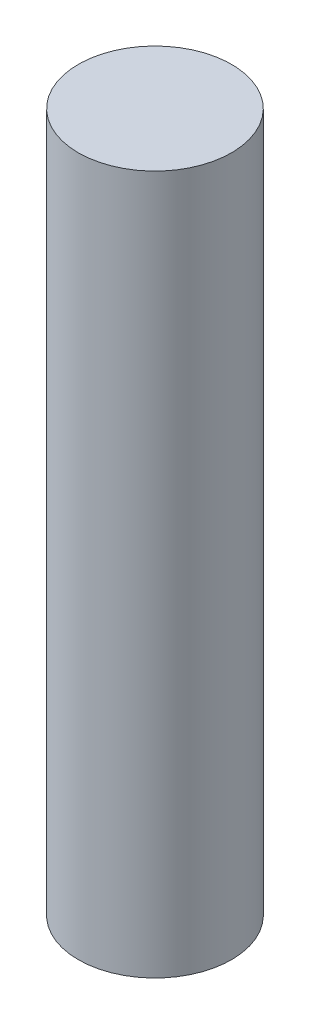
ISO-10303-21;
HEADER;
FILE_DESCRIPTION(('STEP AP214'),'2;1');
FILE_NAME('part.step','',(''),(''),'','','');
FILE_SCHEMA(('AUTOMOTIVE_DESIGN { 1 0 10303 214 1 1 1 1 }'));
ENDSEC;
DATA;
#1=APPLICATION_CONTEXT('core data for automotive mechanical design processes');
#2=APPLICATION_PROTOCOL_DEFINITION('international standard','automotive_design',2000,#1);
#3=PRODUCT_CONTEXT('',#1,'mechanical');
#4=PRODUCT('Part','Part','',(#3));
#5=PRODUCT_RELATED_PRODUCT_CATEGORY('part','',(#4));
#6=PRODUCT_DEFINITION_FORMATION('','',#4);
#7=PRODUCT_DEFINITION_CONTEXT('part definition',#1,'design');
#8=PRODUCT_DEFINITION('design','',#6,#7);
#9=PRODUCT_DEFINITION_SHAPE('','',#8);
#10=(LENGTH_UNIT() NAMED_UNIT(*) SI_UNIT(.MILLI.,.METRE.));
#11=(NAMED_UNIT(*) PLANE_ANGLE_UNIT() SI_UNIT($,.RADIAN.));
#12=(NAMED_UNIT(*) SI_UNIT($,.STERADIAN.) SOLID_ANGLE_UNIT());
#13=UNCERTAINTY_MEASURE_WITH_UNIT(LENGTH_MEASURE(1.E-05),#10,'distance_accuracy_value','');
#14=(GEOMETRIC_REPRESENTATION_CONTEXT(3) GLOBAL_UNCERTAINTY_ASSIGNED_CONTEXT((#13)) GLOBAL_UNIT_ASSIGNED_CONTEXT((#10,
#11,#12)) REPRESENTATION_CONTEXT('',''));
#15=CARTESIAN_POINT('',(0.,0.,0.));
#16=DIRECTION('',(0.,0.,1.));
#17=DIRECTION('',(1.,0.,0.));
#18=AXIS2_PLACEMENT_3D('',#15,#16,#17);
#19=CARTESIAN_POINT('',(0.,463.296,0.));
#20=DIRECTION('',(0.,-1.,0.));
#21=DIRECTION('',(0.,0.,-1.));
#22=AXIS2_PLACEMENT_3D('',#19,#20,#21);
#23=CYLINDRICAL_SURFACE('',#22,50.8);
#24=CARTESIAN_POINT('',(0.,463.296,0.));
#25=DIRECTION('',(0.,1.,0.));
#26=DIRECTION('',(0.,0.,1.));
#27=AXIS2_PLACEMENT_3D('',#24,#25,#26);
#28=CIRCLE('',#27,50.8);
#29=CARTESIAN_POINT('',(0.,463.296,50.8));
#30=VERTEX_POINT('',#29);
#31=EDGE_CURVE('E10',#30,#30,#28,.T.);
#32=ORIENTED_EDGE('',*,*,#31,.F.);
#33=EDGE_LOOP('',(#32));
#34=FACE_BOUND('',#33,.T.);
#35=CARTESIAN_POINT('',(0.,0.,0.));
#36=DIRECTION('',(0.,1.,0.));
#37=DIRECTION('',(0.,0.,1.));
#38=AXIS2_PLACEMENT_3D('',#35,#36,#37);
#39=CIRCLE('',#38,50.8);
#40=CARTESIAN_POINT('',(0.,0.,50.8));
#41=VERTEX_POINT('',#40);
#42=EDGE_CURVE('E41',#41,#41,#39,.T.);
#43=ORIENTED_EDGE('',*,*,#42,.T.);
#44=EDGE_LOOP('',(#43));
#45=FACE_BOUND('',#44,.T.);
#46=ADVANCED_FACE('F38',(#34,#45),#23,.T.);
#47=CARTESIAN_POINT('',(0.,463.296,0.));
#48=DIRECTION('',(0.,1.,0.));
#49=DIRECTION('',(0.,0.,1.));
#50=AXIS2_PLACEMENT_3D('',#47,#48,#49);
#51=PLANE('',#50);
#52=ORIENTED_EDGE('',*,*,#31,.T.);
#53=EDGE_LOOP('',(#52));
#54=FACE_BOUND('',#53,.T.);
#55=ADVANCED_FACE('F55',(#54),#51,.T.);
#56=CARTESIAN_POINT('',(0.,0.,0.));
#57=DIRECTION('',(0.,1.,0.));
#58=DIRECTION('',(0.,0.,1.));
#59=AXIS2_PLACEMENT_3D('',#56,#57,#58);
#60=PLANE('',#59);
#61=ORIENTED_EDGE('',*,*,#42,.F.);
#62=EDGE_LOOP('',(#61));
#63=FACE_BOUND('',#62,.T.);
#64=ADVANCED_FACE('F53',(#63),#60,.F.);
#65=CLOSED_SHELL('',(#46,#55,#64));
#66=MANIFOLD_SOLID_BREP('B2',#65);
#67=ADVANCED_BREP_SHAPE_REPRESENTATION('',(#18,#66),#14);
#68=SHAPE_DEFINITION_REPRESENTATION(#9,#67);
ENDSEC;
END-ISO-10303-21;
